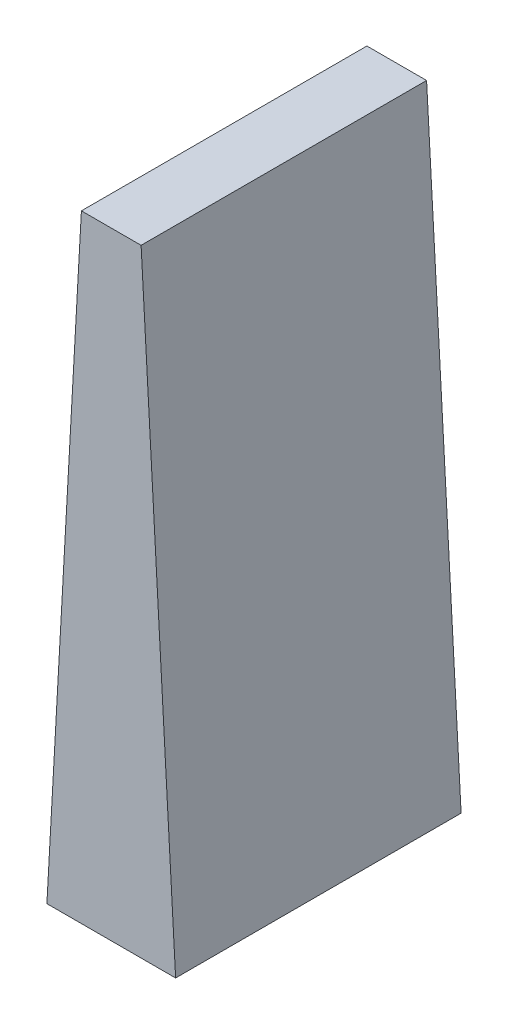
ISO-10303-21;
HEADER;
FILE_DESCRIPTION(('STEP AP214'),'2;1');
FILE_NAME('part.step','',(''),(''),'','','');
FILE_SCHEMA(('AUTOMOTIVE_DESIGN { 1 0 10303 214 1 1 1 1 }'));
ENDSEC;
DATA;
#1=APPLICATION_CONTEXT('core data for automotive mechanical design processes');
#2=APPLICATION_PROTOCOL_DEFINITION('international standard','automotive_design',2000,#1);
#3=PRODUCT_CONTEXT('',#1,'mechanical');
#4=PRODUCT('Part','Part','',(#3));
#5=PRODUCT_RELATED_PRODUCT_CATEGORY('part','',(#4));
#6=PRODUCT_DEFINITION_FORMATION('','',#4);
#7=PRODUCT_DEFINITION_CONTEXT('part definition',#1,'design');
#8=PRODUCT_DEFINITION('design','',#6,#7);
#9=PRODUCT_DEFINITION_SHAPE('','',#8);
#10=(LENGTH_UNIT() NAMED_UNIT(*) SI_UNIT(.MILLI.,.METRE.));
#11=(NAMED_UNIT(*) PLANE_ANGLE_UNIT() SI_UNIT($,.RADIAN.));
#12=(NAMED_UNIT(*) SI_UNIT($,.STERADIAN.) SOLID_ANGLE_UNIT());
#13=UNCERTAINTY_MEASURE_WITH_UNIT(LENGTH_MEASURE(1.E-05),#10,'distance_accuracy_value','');
#14=(GEOMETRIC_REPRESENTATION_CONTEXT(3) GLOBAL_UNCERTAINTY_ASSIGNED_CONTEXT((#13)) GLOBAL_UNIT_ASSIGNED_CONTEXT((#10,
#11,#12)) REPRESENTATION_CONTEXT('',''));
#15=CARTESIAN_POINT('',(0.,0.,0.));
#16=DIRECTION('',(0.,0.,1.));
#17=DIRECTION('',(1.,0.,0.));
#18=AXIS2_PLACEMENT_3D('',#15,#16,#17);
#19=CARTESIAN_POINT('',(0.,-9.652,8.9281));
#20=DIRECTION('',(0.,-1.,0.));
#21=DIRECTION('',(0.,0.,-1.));
#22=AXIS2_PLACEMENT_3D('',#19,#20,#21);
#23=PLANE('',#22);
#24=DIRECTION('',(-1.,0.,0.));
#25=VECTOR('',#24,1.);
#26=CARTESIAN_POINT('',(0.,-9.652,0.));
#27=LINE('',#26,#25);
#28=CARTESIAN_POINT('',(2.01295,-9.652,0.));
#29=VERTEX_POINT('',#28);
#30=CARTESIAN_POINT('',(-2.01295,-9.652,0.));
#31=VERTEX_POINT('',#30);
#32=EDGE_CURVE('E98',#29,#31,#27,.T.);
#33=ORIENTED_EDGE('',*,*,#32,.F.);
#34=DIRECTION('',(0.,0.,-1.));
#35=VECTOR('',#34,1.);
#36=CARTESIAN_POINT('',(2.01295,-9.652,8.9281));
#37=LINE('',#36,#35);
#38=CARTESIAN_POINT('',(2.01295,-9.652,8.9281));
#39=VERTEX_POINT('',#38);
#40=EDGE_CURVE('E11',#39,#29,#37,.T.);
#41=ORIENTED_EDGE('',*,*,#40,.F.);
#42=DIRECTION('',(-1.,0.,0.));
#43=VECTOR('',#42,1.);
#44=CARTESIAN_POINT('',(0.,-9.652,8.9281));
#45=LINE('',#44,#43);
#46=CARTESIAN_POINT('',(-2.01295,-9.652,8.9281));
#47=VERTEX_POINT('',#46);
#48=EDGE_CURVE('E83',#39,#47,#45,.T.);
#49=ORIENTED_EDGE('',*,*,#48,.T.);
#50=DIRECTION('',(0.,0.,-1.));
#51=VECTOR('',#50,1.);
#52=CARTESIAN_POINT('',(-2.01295,-9.652,8.9281));
#53=LINE('',#52,#51);
#54=EDGE_CURVE('E51',#47,#31,#53,.T.);
#55=ORIENTED_EDGE('',*,*,#54,.T.);
#56=EDGE_LOOP('',(#33,#41,#49,#55));
#57=FACE_BOUND('',#56,.T.);
#58=ADVANCED_FACE('F35',(#57),#23,.T.);
#59=CARTESIAN_POINT('',(1.46860742354781,0.0821260730273448,8.9281));
#60=DIRECTION('',(-0.998440075589099,-0.0558338200164959,0.));
#61=DIRECTION('',(0.0558338200164959,-0.998440075589099,0.));
#62=AXIS2_PLACEMENT_3D('',#59,#60,#61);
#63=PLANE('',#62);
#64=DIRECTION('',(-0.0558338200164959,0.998440075589099,0.));
#65=VECTOR('',#64,1.);
#66=CARTESIAN_POINT('',(1.46860742354781,0.0821260730273448,0.));
#67=LINE('',#66,#65);
#68=CARTESIAN_POINT('',(0.933449999999993,9.65199999999999,0.));
#69=VERTEX_POINT('',#68);
#70=EDGE_CURVE('E89',#29,#69,#67,.T.);
#71=ORIENTED_EDGE('',*,*,#70,.T.);
#72=DIRECTION('',(0.,0.,-1.));
#73=VECTOR('',#72,1.);
#74=CARTESIAN_POINT('',(0.933449999999993,9.65199999999999,8.9281));
#75=LINE('',#74,#73);
#76=CARTESIAN_POINT('',(0.933449999999993,9.65199999999999,8.9281));
#77=VERTEX_POINT('',#76);
#78=EDGE_CURVE('E43',#77,#69,#75,.T.);
#79=ORIENTED_EDGE('',*,*,#78,.F.);
#80=DIRECTION('',(-0.0558338200164959,0.998440075589099,0.));
#81=VECTOR('',#80,1.);
#82=CARTESIAN_POINT('',(1.46860742354781,0.0821260730273448,8.9281));
#83=LINE('',#82,#81);
#84=EDGE_CURVE('E77',#39,#77,#83,.T.);
#85=ORIENTED_EDGE('',*,*,#84,.F.);
#86=ORIENTED_EDGE('',*,*,#40,.T.);
#87=EDGE_LOOP('',(#71,#79,#85,#86));
#88=FACE_BOUND('',#87,.T.);
#89=ADVANCED_FACE('F87',(#88),#63,.F.);
#90=CARTESIAN_POINT('',(0.,9.65199999999999,8.9281));
#91=DIRECTION('',(0.,-1.,0.));
#92=DIRECTION('',(1.,0.,0.));
#93=AXIS2_PLACEMENT_3D('',#90,#91,#92);
#94=PLANE('',#93);
#95=DIRECTION('',(-1.,0.,0.));
#96=VECTOR('',#95,1.);
#97=CARTESIAN_POINT('',(0.,9.65199999999999,0.));
#98=LINE('',#97,#96);
#99=CARTESIAN_POINT('',(-0.933450000000007,9.65199999999999,0.));
#100=VERTEX_POINT('',#99);
#101=EDGE_CURVE('E101',#69,#100,#98,.T.);
#102=ORIENTED_EDGE('',*,*,#101,.T.);
#103=DIRECTION('',(0.,0.,-1.));
#104=VECTOR('',#103,1.);
#105=CARTESIAN_POINT('',(-0.933450000000007,9.65199999999999,8.9281));
#106=LINE('',#105,#104);
#107=CARTESIAN_POINT('',(-0.933450000000007,9.65199999999999,8.9281));
#108=VERTEX_POINT('',#107);
#109=EDGE_CURVE('E65',#108,#100,#106,.T.);
#110=ORIENTED_EDGE('',*,*,#109,.F.);
#111=DIRECTION('',(-1.,0.,0.));
#112=VECTOR('',#111,1.);
#113=CARTESIAN_POINT('',(0.,9.65199999999999,8.9281));
#114=LINE('',#113,#112);
#115=EDGE_CURVE('E82',#77,#108,#114,.T.);
#116=ORIENTED_EDGE('',*,*,#115,.F.);
#117=ORIENTED_EDGE('',*,*,#78,.T.);
#118=EDGE_LOOP('',(#102,#110,#116,#117));
#119=FACE_BOUND('',#118,.T.);
#120=ADVANCED_FACE('F92',(#119),#94,.F.);
#121=CARTESIAN_POINT('',(-1.46860742354782,0.0821260730273447,8.9281));
#122=DIRECTION('',(-0.998440075589099,0.0558338200164954,0.));
#123=DIRECTION('',(-0.0558338200164954,-0.998440075589099,0.));
#124=AXIS2_PLACEMENT_3D('',#121,#122,#123);
#125=PLANE('',#124);
#126=DIRECTION('',(0.0558338200164954,0.998440075589099,0.));
#127=VECTOR('',#126,1.);
#128=CARTESIAN_POINT('',(-1.46860742354782,0.0821260730273447,0.));
#129=LINE('',#128,#127);
#130=EDGE_CURVE('E103',#31,#100,#129,.T.);
#131=ORIENTED_EDGE('',*,*,#130,.F.);
#132=ORIENTED_EDGE('',*,*,#54,.F.);
#133=DIRECTION('',(0.0558338200164954,0.998440075589099,0.));
#134=VECTOR('',#133,1.);
#135=CARTESIAN_POINT('',(-1.46860742354782,0.0821260730273447,8.9281));
#136=LINE('',#135,#134);
#137=EDGE_CURVE('E93',#47,#108,#136,.T.);
#138=ORIENTED_EDGE('',*,*,#137,.T.);
#139=ORIENTED_EDGE('',*,*,#109,.T.);
#140=EDGE_LOOP('',(#131,#132,#138,#139));
#141=FACE_BOUND('',#140,.T.);
#142=ADVANCED_FACE('F108',(#141),#125,.T.);
#143=CARTESIAN_POINT('',(0.,0.,8.9281));
#144=DIRECTION('',(0.,0.,1.));
#145=DIRECTION('',(1.,0.,0.));
#146=AXIS2_PLACEMENT_3D('',#143,#144,#145);
#147=PLANE('',#146);
#148=ORIENTED_EDGE('',*,*,#48,.F.);
#149=ORIENTED_EDGE('',*,*,#84,.T.);
#150=ORIENTED_EDGE('',*,*,#115,.T.);
#151=ORIENTED_EDGE('',*,*,#137,.F.);
#152=EDGE_LOOP('',(#148,#149,#150,#151));
#153=FACE_BOUND('',#152,.T.);
#154=ADVANCED_FACE('F79',(#153),#147,.T.);
#155=CARTESIAN_POINT('',(0.,0.,0.));
#156=DIRECTION('',(0.,0.,1.));
#157=DIRECTION('',(1.,0.,0.));
#158=AXIS2_PLACEMENT_3D('',#155,#156,#157);
#159=PLANE('',#158);
#160=ORIENTED_EDGE('',*,*,#32,.T.);
#161=ORIENTED_EDGE('',*,*,#130,.T.);
#162=ORIENTED_EDGE('',*,*,#101,.F.);
#163=ORIENTED_EDGE('',*,*,#70,.F.);
#164=EDGE_LOOP('',(#160,#161,#162,#163));
#165=FACE_BOUND('',#164,.T.);
#166=ADVANCED_FACE('F115',(#165),#159,.F.);
#167=CLOSED_SHELL('',(#58,#89,#120,#142,#154,#166));
#168=MANIFOLD_SOLID_BREP('B2',#167);
#169=ADVANCED_BREP_SHAPE_REPRESENTATION('',(#18,#168),#14);
#170=SHAPE_DEFINITION_REPRESENTATION(#9,#169);
ENDSEC;
END-ISO-10303-21;
